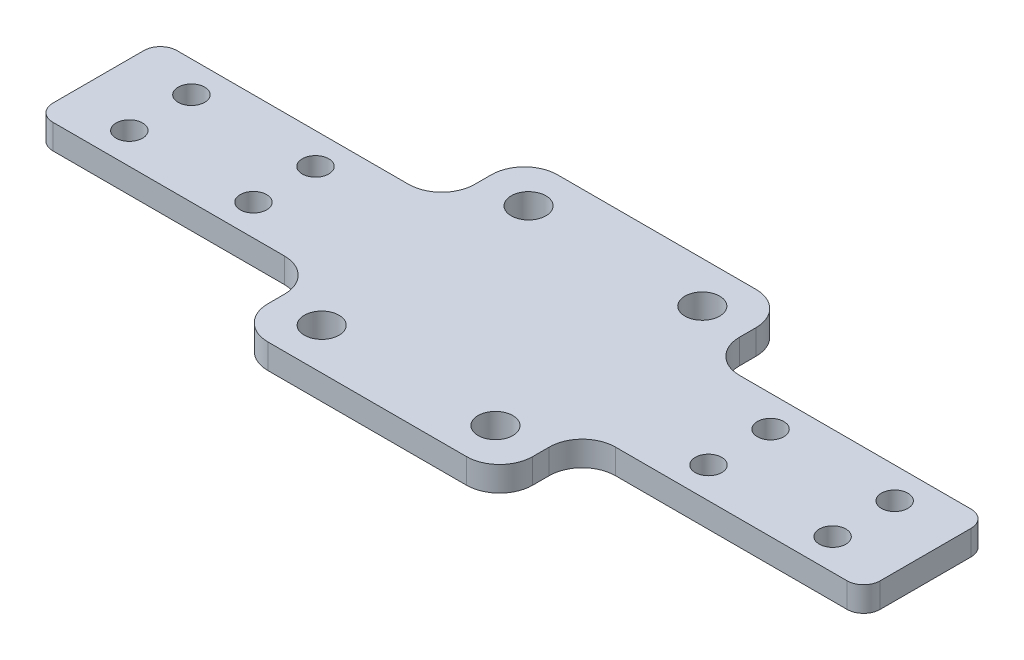
ISO-10303-21;
HEADER;
FILE_DESCRIPTION(('STEP AP214'),'2;1');
FILE_NAME('part.step','',(''),(''),'','','');
FILE_SCHEMA(('AUTOMOTIVE_DESIGN { 1 0 10303 214 1 1 1 1 }'));
ENDSEC;
DATA;
#1=APPLICATION_CONTEXT('core data for automotive mechanical design processes');
#2=APPLICATION_PROTOCOL_DEFINITION('international standard','automotive_design',2000,#1);
#3=PRODUCT_CONTEXT('',#1,'mechanical');
#4=PRODUCT('Part','Part','',(#3));
#5=PRODUCT_RELATED_PRODUCT_CATEGORY('part','',(#4));
#6=PRODUCT_DEFINITION_FORMATION('','',#4);
#7=PRODUCT_DEFINITION_CONTEXT('part definition',#1,'design');
#8=PRODUCT_DEFINITION('design','',#6,#7);
#9=PRODUCT_DEFINITION_SHAPE('','',#8);
#10=(LENGTH_UNIT() NAMED_UNIT(*) SI_UNIT(.MILLI.,.METRE.));
#11=(NAMED_UNIT(*) PLANE_ANGLE_UNIT() SI_UNIT($,.RADIAN.));
#12=(NAMED_UNIT(*) SI_UNIT($,.STERADIAN.) SOLID_ANGLE_UNIT());
#13=UNCERTAINTY_MEASURE_WITH_UNIT(LENGTH_MEASURE(1.E-05),#10,'distance_accuracy_value','');
#14=(GEOMETRIC_REPRESENTATION_CONTEXT(3) GLOBAL_UNCERTAINTY_ASSIGNED_CONTEXT((#13)) GLOBAL_UNIT_ASSIGNED_CONTEXT((#10,
#11,#12)) REPRESENTATION_CONTEXT('',''));
#15=CARTESIAN_POINT('',(0.,0.,0.));
#16=DIRECTION('',(0.,0.,1.));
#17=DIRECTION('',(1.,0.,0.));
#18=AXIS2_PLACEMENT_3D('',#15,#16,#17);
#19=CARTESIAN_POINT('',(-50.,3.,-7.5));
#20=DIRECTION('',(0.,0.,1.));
#21=DIRECTION('',(1.,0.,0.));
#22=AXIS2_PLACEMENT_3D('',#19,#20,#21);
#23=PLANE('',#22);
#24=DIRECTION('',(-1.,0.,0.));
#25=VECTOR('',#24,1.);
#26=CARTESIAN_POINT('',(-50.,0.,-7.5));
#27=LINE('',#26,#25);
#28=CARTESIAN_POINT('',(-20.,0.,-7.5));
#29=VERTEX_POINT('',#28);
#30=CARTESIAN_POINT('',(-48.,0.,-7.5));
#31=VERTEX_POINT('',#30);
#32=EDGE_CURVE('E299',#29,#31,#27,.T.);
#33=ORIENTED_EDGE('',*,*,#32,.T.);
#34=DIRECTION('',(0.,-1.,0.));
#35=VECTOR('',#34,1.);
#36=CARTESIAN_POINT('',(-48.,3.,-7.5));
#37=LINE('',#36,#35);
#38=CARTESIAN_POINT('',(-48.,3.,-7.5));
#39=VERTEX_POINT('',#38);
#40=EDGE_CURVE('E56',#31,#39,#37,.F.);
#41=ORIENTED_EDGE('',*,*,#40,.T.);
#42=DIRECTION('',(-1.,0.,0.));
#43=VECTOR('',#42,1.);
#44=CARTESIAN_POINT('',(-50.,3.,-7.5));
#45=LINE('',#44,#43);
#46=CARTESIAN_POINT('',(-20.,3.,-7.5));
#47=VERTEX_POINT('',#46);
#48=EDGE_CURVE('E419',#47,#39,#45,.T.);
#49=ORIENTED_EDGE('',*,*,#48,.F.);
#50=DIRECTION('',(0.,-1.,0.));
#51=VECTOR('',#50,1.);
#52=CARTESIAN_POINT('',(-20.,3.,-7.5));
#53=LINE('',#52,#51);
#54=EDGE_CURVE('E353',#47,#29,#53,.T.);
#55=ORIENTED_EDGE('',*,*,#54,.T.);
#56=EDGE_LOOP('',(#33,#41,#49,#55));
#57=FACE_BOUND('',#56,.T.);
#58=ADVANCED_FACE('F41',(#57),#23,.F.);
#59=CARTESIAN_POINT('',(-50.,3.,7.5));
#60=DIRECTION('',(0.,0.,-1.));
#61=DIRECTION('',(-1.,0.,0.));
#62=AXIS2_PLACEMENT_3D('',#59,#60,#61);
#63=PLANE('',#62);
#64=DIRECTION('',(1.,0.,0.));
#65=VECTOR('',#64,1.);
#66=CARTESIAN_POINT('',(-50.,3.,7.5));
#67=LINE('',#66,#65);
#68=CARTESIAN_POINT('',(-48.,3.,7.5));
#69=VERTEX_POINT('',#68);
#70=CARTESIAN_POINT('',(-20.,3.,7.5));
#71=VERTEX_POINT('',#70);
#72=EDGE_CURVE('E218',#69,#71,#67,.T.);
#73=ORIENTED_EDGE('',*,*,#72,.F.);
#74=DIRECTION('',(0.,-1.,0.));
#75=VECTOR('',#74,1.);
#76=CARTESIAN_POINT('',(-48.,3.,7.5));
#77=LINE('',#76,#75);
#78=CARTESIAN_POINT('',(-48.,0.,7.5));
#79=VERTEX_POINT('',#78);
#80=EDGE_CURVE('E235',#69,#79,#77,.T.);
#81=ORIENTED_EDGE('',*,*,#80,.T.);
#82=DIRECTION('',(1.,0.,0.));
#83=VECTOR('',#82,1.);
#84=CARTESIAN_POINT('',(-50.,0.,7.5));
#85=LINE('',#84,#83);
#86=CARTESIAN_POINT('',(-20.,0.,7.5));
#87=VERTEX_POINT('',#86);
#88=EDGE_CURVE('E312',#79,#87,#85,.T.);
#89=ORIENTED_EDGE('',*,*,#88,.T.);
#90=DIRECTION('',(0.,1.,0.));
#91=VECTOR('',#90,1.);
#92=CARTESIAN_POINT('',(-20.,3.,7.5));
#93=LINE('',#92,#91);
#94=EDGE_CURVE('E234',#87,#71,#93,.T.);
#95=ORIENTED_EDGE('',*,*,#94,.T.);
#96=EDGE_LOOP('',(#73,#81,#89,#95));
#97=FACE_BOUND('',#96,.T.);
#98=ADVANCED_FACE('F397',(#97),#63,.F.);
#99=CARTESIAN_POINT('',(50.,3.,7.5));
#100=DIRECTION('',(-1.,0.,0.));
#101=DIRECTION('',(0.,0.,1.));
#102=AXIS2_PLACEMENT_3D('',#99,#100,#101);
#103=PLANE('',#102);
#104=DIRECTION('',(0.,0.,-1.));
#105=VECTOR('',#104,1.);
#106=CARTESIAN_POINT('',(50.,3.,7.5));
#107=LINE('',#106,#105);
#108=CARTESIAN_POINT('',(50.,3.,5.5));
#109=VERTEX_POINT('',#108);
#110=CARTESIAN_POINT('',(50.,3.,-5.5));
#111=VERTEX_POINT('',#110);
#112=EDGE_CURVE('E297',#109,#111,#107,.T.);
#113=ORIENTED_EDGE('',*,*,#112,.F.);
#114=DIRECTION('',(0.,-1.,0.));
#115=VECTOR('',#114,1.);
#116=CARTESIAN_POINT('',(50.,3.,5.5));
#117=LINE('',#116,#115);
#118=CARTESIAN_POINT('',(50.,0.,5.5));
#119=VERTEX_POINT('',#118);
#120=EDGE_CURVE('E267',#109,#119,#117,.T.);
#121=ORIENTED_EDGE('',*,*,#120,.T.);
#122=DIRECTION('',(0.,0.,-1.));
#123=VECTOR('',#122,1.);
#124=CARTESIAN_POINT('',(50.,0.,7.5));
#125=LINE('',#124,#123);
#126=CARTESIAN_POINT('',(50.,0.,-5.5));
#127=VERTEX_POINT('',#126);
#128=EDGE_CURVE('E295',#119,#127,#125,.T.);
#129=ORIENTED_EDGE('',*,*,#128,.T.);
#130=DIRECTION('',(0.,-1.,0.));
#131=VECTOR('',#130,1.);
#132=CARTESIAN_POINT('',(50.,3.,-5.5));
#133=LINE('',#132,#131);
#134=EDGE_CURVE('E265',#127,#111,#133,.F.);
#135=ORIENTED_EDGE('',*,*,#134,.T.);
#136=EDGE_LOOP('',(#113,#121,#129,#135));
#137=FACE_BOUND('',#136,.T.);
#138=ADVANCED_FACE('F294',(#137),#103,.F.);
#139=CARTESIAN_POINT('',(48.,3.,-7.5));
#140=VERTEX_POINT('',#139);
#141=CARTESIAN_POINT('',(20.,3.,-7.5));
#142=VERTEX_POINT('',#141);
#143=EDGE_CURVE('E415',#140,#142,#45,.T.);
#144=ORIENTED_EDGE('',*,*,#143,.F.);
#145=DIRECTION('',(0.,-1.,0.));
#146=VECTOR('',#145,1.);
#147=CARTESIAN_POINT('',(48.,3.,-7.5));
#148=LINE('',#147,#146);
#149=CARTESIAN_POINT('',(48.,0.,-7.5));
#150=VERTEX_POINT('',#149);
#151=EDGE_CURVE('E11',#140,#150,#148,.T.);
#152=ORIENTED_EDGE('',*,*,#151,.T.);
#153=CARTESIAN_POINT('',(20.,0.,-7.5));
#154=VERTEX_POINT('',#153);
#155=EDGE_CURVE('E302',#150,#154,#27,.T.);
#156=ORIENTED_EDGE('',*,*,#155,.T.);
#157=DIRECTION('',(0.,1.,0.));
#158=VECTOR('',#157,1.);
#159=CARTESIAN_POINT('',(20.,3.,-7.5));
#160=LINE('',#159,#158);
#161=EDGE_CURVE('E356',#154,#142,#160,.T.);
#162=ORIENTED_EDGE('',*,*,#161,.T.);
#163=EDGE_LOOP('',(#144,#152,#156,#162));
#164=FACE_BOUND('',#163,.T.);
#165=ADVANCED_FACE('F399',(#164),#23,.F.);
#166=CARTESIAN_POINT('',(-50.,3.,7.5));
#167=DIRECTION('',(1.,0.,0.));
#168=DIRECTION('',(0.,0.,-1.));
#169=AXIS2_PLACEMENT_3D('',#166,#167,#168);
#170=PLANE('',#169);
#171=DIRECTION('',(0.,0.,1.));
#172=VECTOR('',#171,1.);
#173=CARTESIAN_POINT('',(-50.,0.,7.5));
#174=LINE('',#173,#172);
#175=CARTESIAN_POINT('',(-50.,0.,-5.5));
#176=VERTEX_POINT('',#175);
#177=CARTESIAN_POINT('',(-50.,0.,5.5));
#178=VERTEX_POINT('',#177);
#179=EDGE_CURVE('E309',#176,#178,#174,.T.);
#180=ORIENTED_EDGE('',*,*,#179,.T.);
#181=DIRECTION('',(0.,-1.,0.));
#182=VECTOR('',#181,1.);
#183=CARTESIAN_POINT('',(-50.,3.,5.5));
#184=LINE('',#183,#182);
#185=CARTESIAN_POINT('',(-50.,3.,5.5));
#186=VERTEX_POINT('',#185);
#187=EDGE_CURVE('E255',#178,#186,#184,.F.);
#188=ORIENTED_EDGE('',*,*,#187,.T.);
#189=DIRECTION('',(0.,0.,1.));
#190=VECTOR('',#189,1.);
#191=CARTESIAN_POINT('',(-50.,3.,7.5));
#192=LINE('',#191,#190);
#193=CARTESIAN_POINT('',(-50.,3.,-5.5));
#194=VERTEX_POINT('',#193);
#195=EDGE_CURVE('E287',#194,#186,#192,.T.);
#196=ORIENTED_EDGE('',*,*,#195,.F.);
#197=DIRECTION('',(0.,-1.,0.));
#198=VECTOR('',#197,1.);
#199=CARTESIAN_POINT('',(-50.,3.,-5.5));
#200=LINE('',#199,#198);
#201=EDGE_CURVE('E252',#194,#176,#200,.T.);
#202=ORIENTED_EDGE('',*,*,#201,.T.);
#203=EDGE_LOOP('',(#180,#188,#196,#202));
#204=FACE_BOUND('',#203,.T.);
#205=ADVANCED_FACE('F408',(#204),#170,.F.);
#206=CARTESIAN_POINT('',(20.,0.,7.5));
#207=VERTEX_POINT('',#206);
#208=CARTESIAN_POINT('',(48.,0.,7.5));
#209=VERTEX_POINT('',#208);
#210=EDGE_CURVE('E279',#207,#209,#85,.T.);
#211=ORIENTED_EDGE('',*,*,#210,.T.);
#212=DIRECTION('',(0.,-1.,0.));
#213=VECTOR('',#212,1.);
#214=CARTESIAN_POINT('',(48.,3.,7.5));
#215=LINE('',#214,#213);
#216=CARTESIAN_POINT('',(48.,3.,7.5));
#217=VERTEX_POINT('',#216);
#218=EDGE_CURVE('E49',#209,#217,#215,.F.);
#219=ORIENTED_EDGE('',*,*,#218,.T.);
#220=CARTESIAN_POINT('',(20.,3.,7.5));
#221=VERTEX_POINT('',#220);
#222=EDGE_CURVE('E276',#221,#217,#67,.T.);
#223=ORIENTED_EDGE('',*,*,#222,.F.);
#224=DIRECTION('',(0.,-1.,0.));
#225=VECTOR('',#224,1.);
#226=CARTESIAN_POINT('',(20.,3.,7.5));
#227=LINE('',#226,#225);
#228=EDGE_CURVE('E359',#221,#207,#227,.T.);
#229=ORIENTED_EDGE('',*,*,#228,.T.);
#230=EDGE_LOOP('',(#211,#219,#223,#229));
#231=FACE_BOUND('',#230,.T.);
#232=ADVANCED_FACE('F274',(#231),#63,.F.);
#233=CARTESIAN_POINT('',(0.,3.,0.));
#234=DIRECTION('',(0.,-1.,0.));
#235=DIRECTION('',(0.,0.,-1.));
#236=AXIS2_PLACEMENT_3D('',#233,#234,#235);
#237=PLANE('',#236);
#238=CARTESIAN_POINT('',(10.5,3.,-12.5));
#239=DIRECTION('',(0.,1.,0.));
#240=DIRECTION('',(0.,0.,-1.));
#241=AXIS2_PLACEMENT_3D('',#238,#239,#240);
#242=CIRCLE('',#241,2.1);
#243=CARTESIAN_POINT('',(10.5,3.,-14.6));
#244=VERTEX_POINT('',#243);
#245=EDGE_CURVE('E567',#244,#244,#242,.T.);
#246=ORIENTED_EDGE('',*,*,#245,.F.);
#247=EDGE_LOOP('',(#246));
#248=FACE_BOUND('',#247,.T.);
#249=CARTESIAN_POINT('',(10.5,3.,12.5));
#250=DIRECTION('',(0.,1.,0.));
#251=DIRECTION('',(0.,0.,1.));
#252=AXIS2_PLACEMENT_3D('',#249,#250,#251);
#253=CIRCLE('',#252,2.1);
#254=CARTESIAN_POINT('',(10.5,3.,14.6));
#255=VERTEX_POINT('',#254);
#256=EDGE_CURVE('E573',#255,#255,#253,.T.);
#257=ORIENTED_EDGE('',*,*,#256,.F.);
#258=EDGE_LOOP('',(#257));
#259=FACE_BOUND('',#258,.T.);
#260=CARTESIAN_POINT('',(-10.5,3.,12.5));
#261=DIRECTION('',(0.,1.,0.));
#262=DIRECTION('',(0.,0.,-1.));
#263=AXIS2_PLACEMENT_3D('',#260,#261,#262);
#264=CIRCLE('',#263,2.1);
#265=CARTESIAN_POINT('',(-10.5,3.,10.4));
#266=VERTEX_POINT('',#265);
#267=EDGE_CURVE('E561',#266,#266,#264,.T.);
#268=ORIENTED_EDGE('',*,*,#267,.F.);
#269=EDGE_LOOP('',(#268));
#270=FACE_BOUND('',#269,.T.);
#271=CARTESIAN_POINT('',(-10.5,3.,-12.5));
#272=DIRECTION('',(0.,1.,0.));
#273=DIRECTION('',(0.,0.,1.));
#274=AXIS2_PLACEMENT_3D('',#271,#272,#273);
#275=CIRCLE('',#274,2.1);
#276=CARTESIAN_POINT('',(-10.5,3.,-10.4));
#277=VERTEX_POINT('',#276);
#278=EDGE_CURVE('E558',#277,#277,#275,.T.);
#279=ORIENTED_EDGE('',*,*,#278,.F.);
#280=EDGE_LOOP('',(#279));
#281=FACE_BOUND('',#280,.T.);
#282=CARTESIAN_POINT('',(42.5,3.,3.75));
#283=DIRECTION('',(0.,1.,0.));
#284=DIRECTION('',(0.,0.,1.));
#285=AXIS2_PLACEMENT_3D('',#282,#283,#284);
#286=CIRCLE('',#285,1.6);
#287=CARTESIAN_POINT('',(42.5,3.,5.35));
#288=VERTEX_POINT('',#287);
#289=EDGE_CURVE('E531',#288,#288,#286,.T.);
#290=ORIENTED_EDGE('',*,*,#289,.F.);
#291=EDGE_LOOP('',(#290));
#292=FACE_BOUND('',#291,.T.);
#293=CARTESIAN_POINT('',(-27.5,3.,-3.75));
#294=DIRECTION('',(0.,1.,0.));
#295=DIRECTION('',(0.,0.,-1.));
#296=AXIS2_PLACEMENT_3D('',#293,#294,#295);
#297=CIRCLE('',#296,1.6);
#298=CARTESIAN_POINT('',(-27.5,3.,-5.35));
#299=VERTEX_POINT('',#298);
#300=EDGE_CURVE('E520',#299,#299,#297,.T.);
#301=ORIENTED_EDGE('',*,*,#300,.F.);
#302=EDGE_LOOP('',(#301));
#303=FACE_BOUND('',#302,.T.);
#304=CARTESIAN_POINT('',(-27.5,3.,3.75));
#305=DIRECTION('',(0.,1.,0.));
#306=DIRECTION('',(0.,0.,1.));
#307=AXIS2_PLACEMENT_3D('',#304,#305,#306);
#308=CIRCLE('',#307,1.6);
#309=CARTESIAN_POINT('',(-27.5,3.,5.35));
#310=VERTEX_POINT('',#309);
#311=EDGE_CURVE('E519',#310,#310,#308,.T.);
#312=ORIENTED_EDGE('',*,*,#311,.F.);
#313=EDGE_LOOP('',(#312));
#314=FACE_BOUND('',#313,.T.);
#315=CARTESIAN_POINT('',(-42.5,3.,3.75));
#316=DIRECTION('',(0.,1.,0.));
#317=DIRECTION('',(0.,0.,-1.));
#318=AXIS2_PLACEMENT_3D('',#315,#316,#317);
#319=CIRCLE('',#318,1.6);
#320=CARTESIAN_POINT('',(-42.5,3.,2.15));
#321=VERTEX_POINT('',#320);
#322=EDGE_CURVE('E514',#321,#321,#319,.T.);
#323=ORIENTED_EDGE('',*,*,#322,.F.);
#324=EDGE_LOOP('',(#323));
#325=FACE_BOUND('',#324,.T.);
#326=CARTESIAN_POINT('',(27.5,3.,-3.75));
#327=DIRECTION('',(0.,1.,0.));
#328=DIRECTION('',(0.,0.,1.));
#329=AXIS2_PLACEMENT_3D('',#326,#327,#328);
#330=CIRCLE('',#329,1.6);
#331=CARTESIAN_POINT('',(27.5,3.,-2.15));
#332=VERTEX_POINT('',#331);
#333=EDGE_CURVE('E544',#332,#332,#330,.T.);
#334=ORIENTED_EDGE('',*,*,#333,.F.);
#335=EDGE_LOOP('',(#334));
#336=FACE_BOUND('',#335,.T.);
#337=CARTESIAN_POINT('',(27.5,3.,3.75));
#338=DIRECTION('',(0.,1.,0.));
#339=DIRECTION('',(0.,0.,-1.));
#340=AXIS2_PLACEMENT_3D('',#337,#338,#339);
#341=CIRCLE('',#340,1.6);
#342=CARTESIAN_POINT('',(27.5,3.,2.15));
#343=VERTEX_POINT('',#342);
#344=EDGE_CURVE('E543',#343,#343,#341,.T.);
#345=ORIENTED_EDGE('',*,*,#344,.F.);
#346=EDGE_LOOP('',(#345));
#347=FACE_BOUND('',#346,.T.);
#348=CARTESIAN_POINT('',(42.5,3.,-3.75));
#349=DIRECTION('',(0.,1.,0.));
#350=DIRECTION('',(0.,0.,-1.));
#351=AXIS2_PLACEMENT_3D('',#348,#349,#350);
#352=CIRCLE('',#351,1.6);
#353=CARTESIAN_POINT('',(42.5,3.,-5.35));
#354=VERTEX_POINT('',#353);
#355=EDGE_CURVE('E532',#354,#354,#352,.T.);
#356=ORIENTED_EDGE('',*,*,#355,.F.);
#357=EDGE_LOOP('',(#356));
#358=FACE_BOUND('',#357,.T.);
#359=CARTESIAN_POINT('',(-42.5,3.,-3.75));
#360=DIRECTION('',(0.,1.,0.));
#361=DIRECTION('',(0.,0.,1.));
#362=AXIS2_PLACEMENT_3D('',#359,#360,#361);
#363=CIRCLE('',#362,1.6);
#364=CARTESIAN_POINT('',(-42.5,3.,-2.15));
#365=VERTEX_POINT('',#364);
#366=EDGE_CURVE('E453',#365,#365,#363,.T.);
#367=ORIENTED_EDGE('',*,*,#366,.F.);
#368=EDGE_LOOP('',(#367));
#369=FACE_BOUND('',#368,.T.);
#370=ORIENTED_EDGE('',*,*,#195,.T.);
#371=CARTESIAN_POINT('',(-48.,3.,5.5));
#372=DIRECTION('',(0.,-1.,0.));
#373=DIRECTION('',(0.,0.,-1.));
#374=AXIS2_PLACEMENT_3D('',#371,#372,#373);
#375=CIRCLE('',#374,2.);
#376=EDGE_CURVE('E262',#186,#69,#375,.F.);
#377=ORIENTED_EDGE('',*,*,#376,.T.);
#378=ORIENTED_EDGE('',*,*,#72,.T.);
#379=CARTESIAN_POINT('',(-20.,3.,11.5));
#380=DIRECTION('',(0.,-1.,0.));
#381=DIRECTION('',(0.,0.,-1.));
#382=AXIS2_PLACEMENT_3D('',#379,#380,#381);
#383=CIRCLE('',#382,4.);
#384=CARTESIAN_POINT('',(-16.,3.,11.5));
#385=VERTEX_POINT('',#384);
#386=EDGE_CURVE('E236',#71,#385,#383,.T.);
#387=ORIENTED_EDGE('',*,*,#386,.T.);
#388=DIRECTION('',(0.,0.,1.));
#389=VECTOR('',#388,1.);
#390=CARTESIAN_POINT('',(-16.,3.,-17.5));
#391=LINE('',#390,#389);
#392=CARTESIAN_POINT('',(-16.,3.,13.5));
#393=VERTEX_POINT('',#392);
#394=EDGE_CURVE('E213',#385,#393,#391,.T.);
#395=ORIENTED_EDGE('',*,*,#394,.T.);
#396=CARTESIAN_POINT('',(-12.,3.,13.5));
#397=DIRECTION('',(0.,-1.,0.));
#398=DIRECTION('',(0.,0.,-1.));
#399=AXIS2_PLACEMENT_3D('',#396,#397,#398);
#400=CIRCLE('',#399,4.);
#401=CARTESIAN_POINT('',(-12.,3.,17.5));
#402=VERTEX_POINT('',#401);
#403=EDGE_CURVE('E321',#393,#402,#400,.F.);
#404=ORIENTED_EDGE('',*,*,#403,.T.);
#405=DIRECTION('',(1.,0.,0.));
#406=VECTOR('',#405,1.);
#407=CARTESIAN_POINT('',(-16.,3.,17.5));
#408=LINE('',#407,#406);
#409=CARTESIAN_POINT('',(12.,3.,17.5));
#410=VERTEX_POINT('',#409);
#411=EDGE_CURVE('E459',#402,#410,#408,.T.);
#412=ORIENTED_EDGE('',*,*,#411,.T.);
#413=CARTESIAN_POINT('',(12.,3.,13.5));
#414=DIRECTION('',(0.,-1.,0.));
#415=DIRECTION('',(0.,0.,-1.));
#416=AXIS2_PLACEMENT_3D('',#413,#414,#415);
#417=CIRCLE('',#416,4.);
#418=CARTESIAN_POINT('',(16.,3.,13.5));
#419=VERTEX_POINT('',#418);
#420=EDGE_CURVE('E319',#410,#419,#417,.F.);
#421=ORIENTED_EDGE('',*,*,#420,.T.);
#422=DIRECTION('',(0.,0.,-1.));
#423=VECTOR('',#422,1.);
#424=CARTESIAN_POINT('',(16.,3.,-17.5));
#425=LINE('',#424,#423);
#426=CARTESIAN_POINT('',(16.,3.,11.5));
#427=VERTEX_POINT('',#426);
#428=EDGE_CURVE('E462',#419,#427,#425,.T.);
#429=ORIENTED_EDGE('',*,*,#428,.T.);
#430=CARTESIAN_POINT('',(20.,3.,11.5));
#431=DIRECTION('',(0.,-1.,0.));
#432=DIRECTION('',(0.,0.,-1.));
#433=AXIS2_PLACEMENT_3D('',#430,#431,#432);
#434=CIRCLE('',#433,4.);
#435=EDGE_CURVE('E241',#427,#221,#434,.T.);
#436=ORIENTED_EDGE('',*,*,#435,.T.);
#437=ORIENTED_EDGE('',*,*,#222,.T.);
#438=CARTESIAN_POINT('',(48.,3.,5.5));
#439=DIRECTION('',(0.,-1.,0.));
#440=DIRECTION('',(0.,0.,-1.));
#441=AXIS2_PLACEMENT_3D('',#438,#439,#440);
#442=CIRCLE('',#441,2.);
#443=EDGE_CURVE('E258',#217,#109,#442,.F.);
#444=ORIENTED_EDGE('',*,*,#443,.T.);
#445=ORIENTED_EDGE('',*,*,#112,.T.);
#446=CARTESIAN_POINT('',(48.,3.,-5.5));
#447=DIRECTION('',(0.,-1.,0.));
#448=DIRECTION('',(0.,0.,-1.));
#449=AXIS2_PLACEMENT_3D('',#446,#447,#448);
#450=CIRCLE('',#449,2.);
#451=EDGE_CURVE('E64',#111,#140,#450,.F.);
#452=ORIENTED_EDGE('',*,*,#451,.T.);
#453=ORIENTED_EDGE('',*,*,#143,.T.);
#454=CARTESIAN_POINT('',(20.,3.,-11.5));
#455=DIRECTION('',(0.,-1.,0.));
#456=DIRECTION('',(0.,0.,-1.));
#457=AXIS2_PLACEMENT_3D('',#454,#455,#456);
#458=CIRCLE('',#457,4.);
#459=CARTESIAN_POINT('',(16.,3.,-11.5));
#460=VERTEX_POINT('',#459);
#461=EDGE_CURVE('E366',#142,#460,#458,.T.);
#462=ORIENTED_EDGE('',*,*,#461,.T.);
#463=CARTESIAN_POINT('',(16.,3.,-13.5));
#464=VERTEX_POINT('',#463);
#465=EDGE_CURVE('E461',#460,#464,#425,.T.);
#466=ORIENTED_EDGE('',*,*,#465,.T.);
#467=CARTESIAN_POINT('',(12.,3.,-13.5));
#468=DIRECTION('',(0.,-1.,0.));
#469=DIRECTION('',(0.,0.,-1.));
#470=AXIS2_PLACEMENT_3D('',#467,#468,#469);
#471=CIRCLE('',#470,4.);
#472=CARTESIAN_POINT('',(12.,3.,-17.5));
#473=VERTEX_POINT('',#472);
#474=EDGE_CURVE('E317',#464,#473,#471,.F.);
#475=ORIENTED_EDGE('',*,*,#474,.T.);
#476=DIRECTION('',(-1.,0.,0.));
#477=VECTOR('',#476,1.);
#478=CARTESIAN_POINT('',(-16.,3.,-17.5));
#479=LINE('',#478,#477);
#480=CARTESIAN_POINT('',(-12.,3.,-17.5));
#481=VERTEX_POINT('',#480);
#482=EDGE_CURVE('E230',#473,#481,#479,.T.);
#483=ORIENTED_EDGE('',*,*,#482,.T.);
#484=CARTESIAN_POINT('',(-12.,3.,-13.5));
#485=DIRECTION('',(0.,-1.,0.));
#486=DIRECTION('',(0.,0.,-1.));
#487=AXIS2_PLACEMENT_3D('',#484,#485,#486);
#488=CIRCLE('',#487,4.);
#489=CARTESIAN_POINT('',(-16.,3.,-13.5));
#490=VERTEX_POINT('',#489);
#491=EDGE_CURVE('E315',#481,#490,#488,.F.);
#492=ORIENTED_EDGE('',*,*,#491,.T.);
#493=CARTESIAN_POINT('',(-16.,3.,-11.5));
#494=VERTEX_POINT('',#493);
#495=EDGE_CURVE('E457',#490,#494,#391,.T.);
#496=ORIENTED_EDGE('',*,*,#495,.T.);
#497=CARTESIAN_POINT('',(-20.,3.,-11.5));
#498=DIRECTION('',(0.,-1.,0.));
#499=DIRECTION('',(0.,0.,-1.));
#500=AXIS2_PLACEMENT_3D('',#497,#498,#499);
#501=CIRCLE('',#500,4.);
#502=EDGE_CURVE('E364',#494,#47,#501,.T.);
#503=ORIENTED_EDGE('',*,*,#502,.T.);
#504=ORIENTED_EDGE('',*,*,#48,.T.);
#505=CARTESIAN_POINT('',(-48.,3.,-5.5));
#506=DIRECTION('',(0.,-1.,0.));
#507=DIRECTION('',(0.,0.,-1.));
#508=AXIS2_PLACEMENT_3D('',#505,#506,#507);
#509=CIRCLE('',#508,2.);
#510=EDGE_CURVE('E260',#39,#194,#509,.F.);
#511=ORIENTED_EDGE('',*,*,#510,.T.);
#512=EDGE_LOOP('',(#370,#377,#378,#387,#395,#404,#412,#421,#429,#436,#437,#444,#445,#452,#453,
#462,#466,#475,#483,#492,#496,#503,#504,#511));
#513=FACE_BOUND('',#512,.T.);
#514=ADVANCED_FACE('F283',(#248,#259,#270,#281,#292,#303,#314,#325,#336,#347,#358,#369,#513),
#237,.F.);
#515=CARTESIAN_POINT('',(0.,0.,0.));
#516=DIRECTION('',(0.,-1.,0.));
#517=DIRECTION('',(0.,0.,-1.));
#518=AXIS2_PLACEMENT_3D('',#515,#516,#517);
#519=PLANE('',#518);
#520=CARTESIAN_POINT('',(10.5,0.,-12.5));
#521=DIRECTION('',(0.,1.,0.));
#522=DIRECTION('',(0.,0.,-1.));
#523=AXIS2_PLACEMENT_3D('',#520,#521,#522);
#524=CIRCLE('',#523,2.1);
#525=CARTESIAN_POINT('',(10.5,0.,-14.6));
#526=VERTEX_POINT('',#525);
#527=EDGE_CURVE('E564',#526,#526,#524,.T.);
#528=ORIENTED_EDGE('',*,*,#527,.T.);
#529=EDGE_LOOP('',(#528));
#530=FACE_BOUND('',#529,.T.);
#531=CARTESIAN_POINT('',(10.5,0.,12.5));
#532=DIRECTION('',(0.,1.,0.));
#533=DIRECTION('',(0.,0.,1.));
#534=AXIS2_PLACEMENT_3D('',#531,#532,#533);
#535=CIRCLE('',#534,2.1);
#536=CARTESIAN_POINT('',(10.5,0.,14.6));
#537=VERTEX_POINT('',#536);
#538=EDGE_CURVE('E570',#537,#537,#535,.T.);
#539=ORIENTED_EDGE('',*,*,#538,.T.);
#540=EDGE_LOOP('',(#539));
#541=FACE_BOUND('',#540,.T.);
#542=CARTESIAN_POINT('',(-10.5,0.,12.5));
#543=DIRECTION('',(0.,1.,0.));
#544=DIRECTION('',(0.,0.,-1.));
#545=AXIS2_PLACEMENT_3D('',#542,#543,#544);
#546=CIRCLE('',#545,2.1);
#547=CARTESIAN_POINT('',(-10.5,0.,10.4));
#548=VERTEX_POINT('',#547);
#549=EDGE_CURVE('E576',#548,#548,#546,.T.);
#550=ORIENTED_EDGE('',*,*,#549,.T.);
#551=EDGE_LOOP('',(#550));
#552=FACE_BOUND('',#551,.T.);
#553=CARTESIAN_POINT('',(-10.5,0.,-12.5));
#554=DIRECTION('',(0.,1.,0.));
#555=DIRECTION('',(0.,0.,1.));
#556=AXIS2_PLACEMENT_3D('',#553,#554,#555);
#557=CIRCLE('',#556,2.1);
#558=CARTESIAN_POINT('',(-10.5,0.,-10.4));
#559=VERTEX_POINT('',#558);
#560=EDGE_CURVE('E555',#559,#559,#557,.T.);
#561=ORIENTED_EDGE('',*,*,#560,.T.);
#562=EDGE_LOOP('',(#561));
#563=FACE_BOUND('',#562,.T.);
#564=CARTESIAN_POINT('',(42.5,0.,3.75));
#565=DIRECTION('',(0.,1.,0.));
#566=DIRECTION('',(0.,0.,1.));
#567=AXIS2_PLACEMENT_3D('',#564,#565,#566);
#568=CIRCLE('',#567,1.6);
#569=CARTESIAN_POINT('',(42.5,0.,5.35));
#570=VERTEX_POINT('',#569);
#571=EDGE_CURVE('E528',#570,#570,#568,.T.);
#572=ORIENTED_EDGE('',*,*,#571,.T.);
#573=EDGE_LOOP('',(#572));
#574=FACE_BOUND('',#573,.T.);
#575=CARTESIAN_POINT('',(-27.5,0.,-3.75));
#576=DIRECTION('',(0.,1.,0.));
#577=DIRECTION('',(0.,0.,-1.));
#578=AXIS2_PLACEMENT_3D('',#575,#576,#577);
#579=CIRCLE('',#578,1.6);
#580=CARTESIAN_POINT('',(-27.5,0.,-5.35));
#581=VERTEX_POINT('',#580);
#582=EDGE_CURVE('E535',#581,#581,#579,.T.);
#583=ORIENTED_EDGE('',*,*,#582,.T.);
#584=EDGE_LOOP('',(#583));
#585=FACE_BOUND('',#584,.T.);
#586=CARTESIAN_POINT('',(-27.5,0.,3.75));
#587=DIRECTION('',(0.,1.,0.));
#588=DIRECTION('',(0.,0.,1.));
#589=AXIS2_PLACEMENT_3D('',#586,#587,#588);
#590=CIRCLE('',#589,1.6);
#591=CARTESIAN_POINT('',(-27.5,0.,5.35));
#592=VERTEX_POINT('',#591);
#593=EDGE_CURVE('E516',#592,#592,#590,.T.);
#594=ORIENTED_EDGE('',*,*,#593,.T.);
#595=EDGE_LOOP('',(#594));
#596=FACE_BOUND('',#595,.T.);
#597=CARTESIAN_POINT('',(-42.5,0.,3.75));
#598=DIRECTION('',(0.,1.,0.));
#599=DIRECTION('',(0.,0.,-1.));
#600=AXIS2_PLACEMENT_3D('',#597,#598,#599);
#601=CIRCLE('',#600,1.6);
#602=CARTESIAN_POINT('',(-42.5,0.,2.15));
#603=VERTEX_POINT('',#602);
#604=EDGE_CURVE('E523',#603,#603,#601,.T.);
#605=ORIENTED_EDGE('',*,*,#604,.T.);
#606=EDGE_LOOP('',(#605));
#607=FACE_BOUND('',#606,.T.);
#608=CARTESIAN_POINT('',(27.5,0.,-3.75));
#609=DIRECTION('',(0.,1.,0.));
#610=DIRECTION('',(0.,0.,1.));
#611=AXIS2_PLACEMENT_3D('',#608,#609,#610);
#612=CIRCLE('',#611,1.6);
#613=CARTESIAN_POINT('',(27.5,0.,-2.15));
#614=VERTEX_POINT('',#613);
#615=EDGE_CURVE('E552',#614,#614,#612,.T.);
#616=ORIENTED_EDGE('',*,*,#615,.T.);
#617=EDGE_LOOP('',(#616));
#618=FACE_BOUND('',#617,.T.);
#619=CARTESIAN_POINT('',(27.5,0.,3.75));
#620=DIRECTION('',(0.,1.,0.));
#621=DIRECTION('',(0.,0.,-1.));
#622=AXIS2_PLACEMENT_3D('',#619,#620,#621);
#623=CIRCLE('',#622,1.6);
#624=CARTESIAN_POINT('',(27.5,0.,2.15));
#625=VERTEX_POINT('',#624);
#626=EDGE_CURVE('E540',#625,#625,#623,.T.);
#627=ORIENTED_EDGE('',*,*,#626,.T.);
#628=EDGE_LOOP('',(#627));
#629=FACE_BOUND('',#628,.T.);
#630=CARTESIAN_POINT('',(42.5,0.,-3.75));
#631=DIRECTION('',(0.,1.,0.));
#632=DIRECTION('',(0.,0.,-1.));
#633=AXIS2_PLACEMENT_3D('',#630,#631,#632);
#634=CIRCLE('',#633,1.6);
#635=CARTESIAN_POINT('',(42.5,0.,-5.35));
#636=VERTEX_POINT('',#635);
#637=EDGE_CURVE('E547',#636,#636,#634,.T.);
#638=ORIENTED_EDGE('',*,*,#637,.T.);
#639=EDGE_LOOP('',(#638));
#640=FACE_BOUND('',#639,.T.);
#641=CARTESIAN_POINT('',(-42.5,0.,-3.75));
#642=DIRECTION('',(0.,1.,0.));
#643=DIRECTION('',(0.,0.,1.));
#644=AXIS2_PLACEMENT_3D('',#641,#642,#643);
#645=CIRCLE('',#644,1.6);
#646=CARTESIAN_POINT('',(-42.5,0.,-2.15));
#647=VERTEX_POINT('',#646);
#648=EDGE_CURVE('E509',#647,#647,#645,.T.);
#649=ORIENTED_EDGE('',*,*,#648,.T.);
#650=EDGE_LOOP('',(#649));
#651=FACE_BOUND('',#650,.T.);
#652=ORIENTED_EDGE('',*,*,#88,.F.);
#653=CARTESIAN_POINT('',(-48.,0.,5.5));
#654=DIRECTION('',(0.,-1.,0.));
#655=DIRECTION('',(0.,0.,-1.));
#656=AXIS2_PLACEMENT_3D('',#653,#654,#655);
#657=CIRCLE('',#656,2.);
#658=EDGE_CURVE('E250',#79,#178,#657,.T.);
#659=ORIENTED_EDGE('',*,*,#658,.T.);
#660=ORIENTED_EDGE('',*,*,#179,.F.);
#661=CARTESIAN_POINT('',(-48.,0.,-5.5));
#662=DIRECTION('',(0.,-1.,0.));
#663=DIRECTION('',(0.,0.,-1.));
#664=AXIS2_PLACEMENT_3D('',#661,#662,#663);
#665=CIRCLE('',#664,2.);
#666=EDGE_CURVE('E248',#176,#31,#665,.T.);
#667=ORIENTED_EDGE('',*,*,#666,.T.);
#668=ORIENTED_EDGE('',*,*,#32,.F.);
#669=CARTESIAN_POINT('',(-20.,0.,-11.5));
#670=DIRECTION('',(0.,-1.,0.));
#671=DIRECTION('',(0.,0.,-1.));
#672=AXIS2_PLACEMENT_3D('',#669,#670,#671);
#673=CIRCLE('',#672,4.);
#674=CARTESIAN_POINT('',(-16.,0.,-11.5));
#675=VERTEX_POINT('',#674);
#676=EDGE_CURVE('E362',#29,#675,#673,.F.);
#677=ORIENTED_EDGE('',*,*,#676,.T.);
#678=DIRECTION('',(0.,0.,1.));
#679=VECTOR('',#678,1.);
#680=CARTESIAN_POINT('',(-16.,0.,-17.5));
#681=LINE('',#680,#679);
#682=CARTESIAN_POINT('',(-16.,0.,-13.5));
#683=VERTEX_POINT('',#682);
#684=EDGE_CURVE('E229',#683,#675,#681,.T.);
#685=ORIENTED_EDGE('',*,*,#684,.F.);
#686=CARTESIAN_POINT('',(-12.,0.,-13.5));
#687=DIRECTION('',(0.,-1.,0.));
#688=DIRECTION('',(0.,0.,-1.));
#689=AXIS2_PLACEMENT_3D('',#686,#687,#688);
#690=CIRCLE('',#689,4.);
#691=CARTESIAN_POINT('',(-12.,0.,-17.5));
#692=VERTEX_POINT('',#691);
#693=EDGE_CURVE('E328',#683,#692,#690,.T.);
#694=ORIENTED_EDGE('',*,*,#693,.T.);
#695=DIRECTION('',(-1.,0.,0.));
#696=VECTOR('',#695,1.);
#697=CARTESIAN_POINT('',(-16.,0.,-17.5));
#698=LINE('',#697,#696);
#699=CARTESIAN_POINT('',(12.,0.,-17.5));
#700=VERTEX_POINT('',#699);
#701=EDGE_CURVE('E300',#700,#692,#698,.T.);
#702=ORIENTED_EDGE('',*,*,#701,.F.);
#703=CARTESIAN_POINT('',(12.,0.,-13.5));
#704=DIRECTION('',(0.,-1.,0.));
#705=DIRECTION('',(0.,0.,-1.));
#706=AXIS2_PLACEMENT_3D('',#703,#704,#705);
#707=CIRCLE('',#706,4.);
#708=CARTESIAN_POINT('',(16.,0.,-13.5));
#709=VERTEX_POINT('',#708);
#710=EDGE_CURVE('E330',#700,#709,#707,.T.);
#711=ORIENTED_EDGE('',*,*,#710,.T.);
#712=DIRECTION('',(0.,0.,-1.));
#713=VECTOR('',#712,1.);
#714=CARTESIAN_POINT('',(16.,0.,-17.5));
#715=LINE('',#714,#713);
#716=CARTESIAN_POINT('',(16.,0.,-11.5));
#717=VERTEX_POINT('',#716);
#718=EDGE_CURVE('E381',#717,#709,#715,.T.);
#719=ORIENTED_EDGE('',*,*,#718,.F.);
#720=CARTESIAN_POINT('',(20.,0.,-11.5));
#721=DIRECTION('',(0.,-1.,0.));
#722=DIRECTION('',(0.,0.,-1.));
#723=AXIS2_PLACEMENT_3D('',#720,#721,#722);
#724=CIRCLE('',#723,4.);
#725=EDGE_CURVE('E368',#717,#154,#724,.F.);
#726=ORIENTED_EDGE('',*,*,#725,.T.);
#727=ORIENTED_EDGE('',*,*,#155,.F.);
#728=CARTESIAN_POINT('',(48.,0.,-5.5));
#729=DIRECTION('',(0.,-1.,0.));
#730=DIRECTION('',(0.,0.,-1.));
#731=AXIS2_PLACEMENT_3D('',#728,#729,#730);
#732=CIRCLE('',#731,2.);
#733=EDGE_CURVE('E239',#150,#127,#732,.T.);
#734=ORIENTED_EDGE('',*,*,#733,.T.);
#735=ORIENTED_EDGE('',*,*,#128,.F.);
#736=CARTESIAN_POINT('',(48.,0.,5.5));
#737=DIRECTION('',(0.,-1.,0.));
#738=DIRECTION('',(0.,0.,-1.));
#739=AXIS2_PLACEMENT_3D('',#736,#737,#738);
#740=CIRCLE('',#739,2.);
#741=EDGE_CURVE('E246',#119,#209,#740,.T.);
#742=ORIENTED_EDGE('',*,*,#741,.T.);
#743=ORIENTED_EDGE('',*,*,#210,.F.);
#744=CARTESIAN_POINT('',(20.,0.,11.5));
#745=DIRECTION('',(0.,-1.,0.));
#746=DIRECTION('',(0.,0.,-1.));
#747=AXIS2_PLACEMENT_3D('',#744,#745,#746);
#748=CIRCLE('',#747,4.);
#749=CARTESIAN_POINT('',(16.,0.,11.5));
#750=VERTEX_POINT('',#749);
#751=EDGE_CURVE('E371',#207,#750,#748,.F.);
#752=ORIENTED_EDGE('',*,*,#751,.T.);
#753=CARTESIAN_POINT('',(16.,0.,13.5));
#754=VERTEX_POINT('',#753);
#755=EDGE_CURVE('E305',#754,#750,#715,.T.);
#756=ORIENTED_EDGE('',*,*,#755,.F.);
#757=CARTESIAN_POINT('',(12.,0.,13.5));
#758=DIRECTION('',(0.,-1.,0.));
#759=DIRECTION('',(0.,0.,-1.));
#760=AXIS2_PLACEMENT_3D('',#757,#758,#759);
#761=CIRCLE('',#760,4.);
#762=CARTESIAN_POINT('',(12.,0.,17.5));
#763=VERTEX_POINT('',#762);
#764=EDGE_CURVE('E332',#754,#763,#761,.T.);
#765=ORIENTED_EDGE('',*,*,#764,.T.);
#766=DIRECTION('',(1.,0.,0.));
#767=VECTOR('',#766,1.);
#768=CARTESIAN_POINT('',(-16.,0.,17.5));
#769=LINE('',#768,#767);
#770=CARTESIAN_POINT('',(-12.,0.,17.5));
#771=VERTEX_POINT('',#770);
#772=EDGE_CURVE('E449',#771,#763,#769,.T.);
#773=ORIENTED_EDGE('',*,*,#772,.F.);
#774=CARTESIAN_POINT('',(-12.,0.,13.5));
#775=DIRECTION('',(0.,-1.,0.));
#776=DIRECTION('',(0.,0.,-1.));
#777=AXIS2_PLACEMENT_3D('',#774,#775,#776);
#778=CIRCLE('',#777,4.);
#779=CARTESIAN_POINT('',(-16.,0.,13.5));
#780=VERTEX_POINT('',#779);
#781=EDGE_CURVE('E228',#771,#780,#778,.T.);
#782=ORIENTED_EDGE('',*,*,#781,.T.);
#783=CARTESIAN_POINT('',(-16.,0.,11.5));
#784=VERTEX_POINT('',#783);
#785=EDGE_CURVE('E210',#784,#780,#681,.T.);
#786=ORIENTED_EDGE('',*,*,#785,.F.);
#787=CARTESIAN_POINT('',(-20.,0.,11.5));
#788=DIRECTION('',(0.,-1.,0.));
#789=DIRECTION('',(0.,0.,-1.));
#790=AXIS2_PLACEMENT_3D('',#787,#788,#789);
#791=CIRCLE('',#790,4.);
#792=EDGE_CURVE('E224',#784,#87,#791,.F.);
#793=ORIENTED_EDGE('',*,*,#792,.T.);
#794=EDGE_LOOP('',(#652,#659,#660,#667,#668,#677,#685,#694,#702,#711,#719,#726,#727,#734,#735,
#742,#743,#752,#756,#765,#773,#782,#786,#793));
#795=FACE_BOUND('',#794,.T.);
#796=ADVANCED_FACE('F223',(#530,#541,#552,#563,#574,#585,#596,#607,#618,#629,#640,#651,#795),
#519,.T.);
#797=CARTESIAN_POINT('',(-16.,0.,17.5));
#798=DIRECTION('',(0.,0.,1.));
#799=DIRECTION('',(1.,0.,0.));
#800=AXIS2_PLACEMENT_3D('',#797,#798,#799);
#801=PLANE('',#800);
#802=ORIENTED_EDGE('',*,*,#411,.F.);
#803=DIRECTION('',(0.,1.,0.));
#804=VECTOR('',#803,1.);
#805=CARTESIAN_POINT('',(-12.,0.,17.5));
#806=LINE('',#805,#804);
#807=EDGE_CURVE('E326',#402,#771,#806,.F.);
#808=ORIENTED_EDGE('',*,*,#807,.T.);
#809=ORIENTED_EDGE('',*,*,#772,.T.);
#810=DIRECTION('',(0.,1.,0.));
#811=VECTOR('',#810,1.);
#812=CARTESIAN_POINT('',(12.,0.,17.5));
#813=LINE('',#812,#811);
#814=EDGE_CURVE('E323',#763,#410,#813,.T.);
#815=ORIENTED_EDGE('',*,*,#814,.T.);
#816=EDGE_LOOP('',(#802,#808,#809,#815));
#817=FACE_BOUND('',#816,.T.);
#818=ADVANCED_FACE('F624',(#817),#801,.T.);
#819=CARTESIAN_POINT('',(16.,0.,-17.5));
#820=DIRECTION('',(1.,0.,0.));
#821=DIRECTION('',(0.,0.,-1.));
#822=AXIS2_PLACEMENT_3D('',#819,#820,#821);
#823=PLANE('',#822);
#824=ORIENTED_EDGE('',*,*,#428,.F.);
#825=DIRECTION('',(0.,1.,0.));
#826=VECTOR('',#825,1.);
#827=CARTESIAN_POINT('',(16.,0.,13.5));
#828=LINE('',#827,#826);
#829=EDGE_CURVE('E337',#419,#754,#828,.F.);
#830=ORIENTED_EDGE('',*,*,#829,.T.);
#831=ORIENTED_EDGE('',*,*,#755,.T.);
#832=DIRECTION('',(0.,-1.,0.));
#833=VECTOR('',#832,1.);
#834=CARTESIAN_POINT('',(16.,0.,11.5));
#835=LINE('',#834,#833);
#836=EDGE_CURVE('E335',#750,#427,#835,.F.);
#837=ORIENTED_EDGE('',*,*,#836,.T.);
#838=EDGE_LOOP('',(#824,#830,#831,#837));
#839=FACE_BOUND('',#838,.T.);
#840=ADVANCED_FACE('F379',(#839),#823,.T.);
#841=CARTESIAN_POINT('',(-16.,0.,-17.5));
#842=DIRECTION('',(-1.,0.,0.));
#843=DIRECTION('',(0.,0.,1.));
#844=AXIS2_PLACEMENT_3D('',#841,#842,#843);
#845=PLANE('',#844);
#846=ORIENTED_EDGE('',*,*,#785,.T.);
#847=DIRECTION('',(0.,1.,0.));
#848=VECTOR('',#847,1.);
#849=CARTESIAN_POINT('',(-16.,0.,13.5));
#850=LINE('',#849,#848);
#851=EDGE_CURVE('E217',#780,#393,#850,.T.);
#852=ORIENTED_EDGE('',*,*,#851,.T.);
#853=ORIENTED_EDGE('',*,*,#394,.F.);
#854=DIRECTION('',(0.,1.,0.));
#855=VECTOR('',#854,1.);
#856=CARTESIAN_POINT('',(-16.,0.,11.5));
#857=LINE('',#856,#855);
#858=EDGE_CURVE('E206',#385,#784,#857,.F.);
#859=ORIENTED_EDGE('',*,*,#858,.T.);
#860=EDGE_LOOP('',(#846,#852,#853,#859));
#861=FACE_BOUND('',#860,.T.);
#862=ADVANCED_FACE('F208',(#861),#845,.T.);
#863=ORIENTED_EDGE('',*,*,#495,.F.);
#864=DIRECTION('',(0.,1.,0.));
#865=VECTOR('',#864,1.);
#866=CARTESIAN_POINT('',(-16.,0.,-13.5));
#867=LINE('',#866,#865);
#868=EDGE_CURVE('E351',#490,#683,#867,.F.);
#869=ORIENTED_EDGE('',*,*,#868,.T.);
#870=ORIENTED_EDGE('',*,*,#684,.T.);
#871=DIRECTION('',(0.,-1.,0.));
#872=VECTOR('',#871,1.);
#873=CARTESIAN_POINT('',(-16.,0.,-11.5));
#874=LINE('',#873,#872);
#875=EDGE_CURVE('E349',#675,#494,#874,.F.);
#876=ORIENTED_EDGE('',*,*,#875,.T.);
#877=EDGE_LOOP('',(#863,#869,#870,#876));
#878=FACE_BOUND('',#877,.T.);
#879=ADVANCED_FACE('F446',(#878),#845,.T.);
#880=ORIENTED_EDGE('',*,*,#718,.T.);
#881=DIRECTION('',(0.,1.,0.));
#882=VECTOR('',#881,1.);
#883=CARTESIAN_POINT('',(16.,0.,-13.5));
#884=LINE('',#883,#882);
#885=EDGE_CURVE('E341',#709,#464,#884,.T.);
#886=ORIENTED_EDGE('',*,*,#885,.T.);
#887=ORIENTED_EDGE('',*,*,#465,.F.);
#888=DIRECTION('',(0.,1.,0.));
#889=VECTOR('',#888,1.);
#890=CARTESIAN_POINT('',(16.,0.,-11.5));
#891=LINE('',#890,#889);
#892=EDGE_CURVE('E339',#460,#717,#891,.F.);
#893=ORIENTED_EDGE('',*,*,#892,.T.);
#894=EDGE_LOOP('',(#880,#886,#887,#893));
#895=FACE_BOUND('',#894,.T.);
#896=ADVANCED_FACE('F469',(#895),#823,.T.);
#897=CARTESIAN_POINT('',(-16.,0.,-17.5));
#898=DIRECTION('',(0.,0.,-1.));
#899=DIRECTION('',(-1.,0.,0.));
#900=AXIS2_PLACEMENT_3D('',#897,#898,#899);
#901=PLANE('',#900);
#902=ORIENTED_EDGE('',*,*,#482,.F.);
#903=DIRECTION('',(0.,1.,0.));
#904=VECTOR('',#903,1.);
#905=CARTESIAN_POINT('',(12.,0.,-17.5));
#906=LINE('',#905,#904);
#907=EDGE_CURVE('E347',#473,#700,#906,.F.);
#908=ORIENTED_EDGE('',*,*,#907,.T.);
#909=ORIENTED_EDGE('',*,*,#701,.T.);
#910=DIRECTION('',(0.,1.,0.));
#911=VECTOR('',#910,1.);
#912=CARTESIAN_POINT('',(-12.,0.,-17.5));
#913=LINE('',#912,#911);
#914=EDGE_CURVE('E344',#692,#481,#913,.T.);
#915=ORIENTED_EDGE('',*,*,#914,.T.);
#916=EDGE_LOOP('',(#902,#908,#909,#915));
#917=FACE_BOUND('',#916,.T.);
#918=ADVANCED_FACE('F479',(#917),#901,.T.);
#919=CARTESIAN_POINT('',(-42.5,0.,-3.75));
#920=DIRECTION('',(0.,1.,0.));
#921=DIRECTION('',(0.,0.,1.));
#922=AXIS2_PLACEMENT_3D('',#919,#920,#921);
#923=CYLINDRICAL_SURFACE('',#922,1.6);
#924=ORIENTED_EDGE('',*,*,#648,.F.);
#925=EDGE_LOOP('',(#924));
#926=FACE_BOUND('',#925,.T.);
#927=ORIENTED_EDGE('',*,*,#366,.T.);
#928=EDGE_LOOP('',(#927));
#929=FACE_BOUND('',#928,.T.);
#930=ADVANCED_FACE('F606',(#926,#929),#923,.F.);
#931=CARTESIAN_POINT('',(42.5,0.,-3.75));
#932=DIRECTION('',(0.,1.,0.));
#933=DIRECTION('',(0.,0.,1.));
#934=AXIS2_PLACEMENT_3D('',#931,#932,#933);
#935=CYLINDRICAL_SURFACE('',#934,1.6);
#936=ORIENTED_EDGE('',*,*,#637,.F.);
#937=EDGE_LOOP('',(#936));
#938=FACE_BOUND('',#937,.T.);
#939=ORIENTED_EDGE('',*,*,#355,.T.);
#940=EDGE_LOOP('',(#939));
#941=FACE_BOUND('',#940,.T.);
#942=ADVANCED_FACE('F608',(#938,#941),#935,.F.);
#943=CARTESIAN_POINT('',(27.5,0.,3.75));
#944=DIRECTION('',(0.,1.,0.));
#945=DIRECTION('',(0.,0.,1.));
#946=AXIS2_PLACEMENT_3D('',#943,#944,#945);
#947=CYLINDRICAL_SURFACE('',#946,1.6);
#948=ORIENTED_EDGE('',*,*,#626,.F.);
#949=EDGE_LOOP('',(#948));
#950=FACE_BOUND('',#949,.T.);
#951=ORIENTED_EDGE('',*,*,#344,.T.);
#952=EDGE_LOOP('',(#951));
#953=FACE_BOUND('',#952,.T.);
#954=ADVANCED_FACE('F614',(#950,#953),#947,.F.);
#955=CARTESIAN_POINT('',(27.5,0.,-3.75));
#956=DIRECTION('',(0.,1.,0.));
#957=DIRECTION('',(0.,0.,1.));
#958=AXIS2_PLACEMENT_3D('',#955,#956,#957);
#959=CYLINDRICAL_SURFACE('',#958,1.6);
#960=ORIENTED_EDGE('',*,*,#615,.F.);
#961=EDGE_LOOP('',(#960));
#962=FACE_BOUND('',#961,.T.);
#963=ORIENTED_EDGE('',*,*,#333,.T.);
#964=EDGE_LOOP('',(#963));
#965=FACE_BOUND('',#964,.T.);
#966=ADVANCED_FACE('F780',(#962,#965),#959,.F.);
#967=CARTESIAN_POINT('',(-42.5,0.,3.75));
#968=DIRECTION('',(0.,1.,0.));
#969=DIRECTION('',(0.,0.,1.));
#970=AXIS2_PLACEMENT_3D('',#967,#968,#969);
#971=CYLINDRICAL_SURFACE('',#970,1.6);
#972=ORIENTED_EDGE('',*,*,#604,.F.);
#973=EDGE_LOOP('',(#972));
#974=FACE_BOUND('',#973,.T.);
#975=ORIENTED_EDGE('',*,*,#322,.T.);
#976=EDGE_LOOP('',(#975));
#977=FACE_BOUND('',#976,.T.);
#978=ADVANCED_FACE('F772',(#974,#977),#971,.F.);
#979=CARTESIAN_POINT('',(-27.5,0.,3.75));
#980=DIRECTION('',(0.,1.,0.));
#981=DIRECTION('',(0.,0.,1.));
#982=AXIS2_PLACEMENT_3D('',#979,#980,#981);
#983=CYLINDRICAL_SURFACE('',#982,1.6);
#984=ORIENTED_EDGE('',*,*,#593,.F.);
#985=EDGE_LOOP('',(#984));
#986=FACE_BOUND('',#985,.T.);
#987=ORIENTED_EDGE('',*,*,#311,.T.);
#988=EDGE_LOOP('',(#987));
#989=FACE_BOUND('',#988,.T.);
#990=ADVANCED_FACE('F619',(#986,#989),#983,.F.);
#991=CARTESIAN_POINT('',(-27.5,0.,-3.75));
#992=DIRECTION('',(0.,1.,0.));
#993=DIRECTION('',(0.,0.,1.));
#994=AXIS2_PLACEMENT_3D('',#991,#992,#993);
#995=CYLINDRICAL_SURFACE('',#994,1.6);
#996=ORIENTED_EDGE('',*,*,#582,.F.);
#997=EDGE_LOOP('',(#996));
#998=FACE_BOUND('',#997,.T.);
#999=ORIENTED_EDGE('',*,*,#300,.T.);
#1000=EDGE_LOOP('',(#999));
#1001=FACE_BOUND('',#1000,.T.);
#1002=ADVANCED_FACE('F755',(#998,#1001),#995,.F.);
#1003=CARTESIAN_POINT('',(42.5,0.,3.75));
#1004=DIRECTION('',(0.,1.,0.));
#1005=DIRECTION('',(0.,0.,1.));
#1006=AXIS2_PLACEMENT_3D('',#1003,#1004,#1005);
#1007=CYLINDRICAL_SURFACE('',#1006,1.6);
#1008=ORIENTED_EDGE('',*,*,#571,.F.);
#1009=EDGE_LOOP('',(#1008));
#1010=FACE_BOUND('',#1009,.T.);
#1011=ORIENTED_EDGE('',*,*,#289,.T.);
#1012=EDGE_LOOP('',(#1011));
#1013=FACE_BOUND('',#1012,.T.);
#1014=ADVANCED_FACE('F746',(#1010,#1013),#1007,.F.);
#1015=CARTESIAN_POINT('',(-10.5,0.,-12.5));
#1016=DIRECTION('',(0.,1.,0.));
#1017=DIRECTION('',(0.,0.,1.));
#1018=AXIS2_PLACEMENT_3D('',#1015,#1016,#1017);
#1019=CYLINDRICAL_SURFACE('',#1018,2.1);
#1020=ORIENTED_EDGE('',*,*,#560,.F.);
#1021=EDGE_LOOP('',(#1020));
#1022=FACE_BOUND('',#1021,.T.);
#1023=ORIENTED_EDGE('',*,*,#278,.T.);
#1024=EDGE_LOOP('',(#1023));
#1025=FACE_BOUND('',#1024,.T.);
#1026=ADVANCED_FACE('F737',(#1022,#1025),#1019,.F.);
#1027=CARTESIAN_POINT('',(-10.5,0.,12.5));
#1028=DIRECTION('',(0.,1.,0.));
#1029=DIRECTION('',(0.,0.,1.));
#1030=AXIS2_PLACEMENT_3D('',#1027,#1028,#1029);
#1031=CYLINDRICAL_SURFACE('',#1030,2.1);
#1032=ORIENTED_EDGE('',*,*,#549,.F.);
#1033=EDGE_LOOP('',(#1032));
#1034=FACE_BOUND('',#1033,.T.);
#1035=ORIENTED_EDGE('',*,*,#267,.T.);
#1036=EDGE_LOOP('',(#1035));
#1037=FACE_BOUND('',#1036,.T.);
#1038=ADVANCED_FACE('F582',(#1034,#1037),#1031,.F.);
#1039=CARTESIAN_POINT('',(10.5,0.,12.5));
#1040=DIRECTION('',(0.,1.,0.));
#1041=DIRECTION('',(0.,0.,1.));
#1042=AXIS2_PLACEMENT_3D('',#1039,#1040,#1041);
#1043=CYLINDRICAL_SURFACE('',#1042,2.1);
#1044=ORIENTED_EDGE('',*,*,#538,.F.);
#1045=EDGE_LOOP('',(#1044));
#1046=FACE_BOUND('',#1045,.T.);
#1047=ORIENTED_EDGE('',*,*,#256,.T.);
#1048=EDGE_LOOP('',(#1047));
#1049=FACE_BOUND('',#1048,.T.);
#1050=ADVANCED_FACE('F504',(#1046,#1049),#1043,.F.);
#1051=CARTESIAN_POINT('',(10.5,0.,-12.5));
#1052=DIRECTION('',(0.,1.,0.));
#1053=DIRECTION('',(0.,0.,1.));
#1054=AXIS2_PLACEMENT_3D('',#1051,#1052,#1053);
#1055=CYLINDRICAL_SURFACE('',#1054,2.1);
#1056=ORIENTED_EDGE('',*,*,#527,.F.);
#1057=EDGE_LOOP('',(#1056));
#1058=FACE_BOUND('',#1057,.T.);
#1059=ORIENTED_EDGE('',*,*,#245,.T.);
#1060=EDGE_LOOP('',(#1059));
#1061=FACE_BOUND('',#1060,.T.);
#1062=ADVANCED_FACE('F498',(#1058,#1061),#1055,.F.);
#1063=CARTESIAN_POINT('',(-12.,0.,13.5));
#1064=DIRECTION('',(0.,1.,0.));
#1065=DIRECTION('',(0.,0.,1.));
#1066=AXIS2_PLACEMENT_3D('',#1063,#1064,#1065);
#1067=CYLINDRICAL_SURFACE('',#1066,4.);
#1068=ORIENTED_EDGE('',*,*,#781,.F.);
#1069=ORIENTED_EDGE('',*,*,#807,.F.);
#1070=ORIENTED_EDGE('',*,*,#403,.F.);
#1071=ORIENTED_EDGE('',*,*,#851,.F.);
#1072=EDGE_LOOP('',(#1068,#1069,#1070,#1071));
#1073=FACE_BOUND('',#1072,.T.);
#1074=ADVANCED_FACE('F495',(#1073),#1067,.T.);
#1075=CARTESIAN_POINT('',(12.,0.,13.5));
#1076=DIRECTION('',(0.,1.,0.));
#1077=DIRECTION('',(0.,0.,1.));
#1078=AXIS2_PLACEMENT_3D('',#1075,#1076,#1077);
#1079=CYLINDRICAL_SURFACE('',#1078,4.);
#1080=ORIENTED_EDGE('',*,*,#764,.F.);
#1081=ORIENTED_EDGE('',*,*,#829,.F.);
#1082=ORIENTED_EDGE('',*,*,#420,.F.);
#1083=ORIENTED_EDGE('',*,*,#814,.F.);
#1084=EDGE_LOOP('',(#1080,#1081,#1082,#1083));
#1085=FACE_BOUND('',#1084,.T.);
#1086=ADVANCED_FACE('F490',(#1085),#1079,.T.);
#1087=CARTESIAN_POINT('',(12.,0.,-13.5));
#1088=DIRECTION('',(0.,1.,0.));
#1089=DIRECTION('',(0.,0.,1.));
#1090=AXIS2_PLACEMENT_3D('',#1087,#1088,#1089);
#1091=CYLINDRICAL_SURFACE('',#1090,4.);
#1092=ORIENTED_EDGE('',*,*,#710,.F.);
#1093=ORIENTED_EDGE('',*,*,#907,.F.);
#1094=ORIENTED_EDGE('',*,*,#474,.F.);
#1095=ORIENTED_EDGE('',*,*,#885,.F.);
#1096=EDGE_LOOP('',(#1092,#1093,#1094,#1095));
#1097=FACE_BOUND('',#1096,.T.);
#1098=ADVANCED_FACE('F476',(#1097),#1091,.T.);
#1099=CARTESIAN_POINT('',(-12.,0.,-13.5));
#1100=DIRECTION('',(0.,1.,0.));
#1101=DIRECTION('',(0.,0.,1.));
#1102=AXIS2_PLACEMENT_3D('',#1099,#1100,#1101);
#1103=CYLINDRICAL_SURFACE('',#1102,4.);
#1104=ORIENTED_EDGE('',*,*,#693,.F.);
#1105=ORIENTED_EDGE('',*,*,#868,.F.);
#1106=ORIENTED_EDGE('',*,*,#491,.F.);
#1107=ORIENTED_EDGE('',*,*,#914,.F.);
#1108=EDGE_LOOP('',(#1104,#1105,#1106,#1107));
#1109=FACE_BOUND('',#1108,.T.);
#1110=ADVANCED_FACE('F482',(#1109),#1103,.T.);
#1111=CARTESIAN_POINT('',(-20.,3.,-11.5));
#1112=DIRECTION('',(0.,-1.,0.));
#1113=DIRECTION('',(0.,0.,-1.));
#1114=AXIS2_PLACEMENT_3D('',#1111,#1112,#1113);
#1115=CYLINDRICAL_SURFACE('',#1114,4.);
#1116=ORIENTED_EDGE('',*,*,#502,.F.);
#1117=ORIENTED_EDGE('',*,*,#875,.F.);
#1118=ORIENTED_EDGE('',*,*,#676,.F.);
#1119=ORIENTED_EDGE('',*,*,#54,.F.);
#1120=EDGE_LOOP('',(#1116,#1117,#1118,#1119));
#1121=FACE_BOUND('',#1120,.T.);
#1122=ADVANCED_FACE('F393',(#1121),#1115,.F.);
#1123=CARTESIAN_POINT('',(20.,3.,-11.5));
#1124=DIRECTION('',(0.,1.,0.));
#1125=DIRECTION('',(0.,0.,1.));
#1126=AXIS2_PLACEMENT_3D('',#1123,#1124,#1125);
#1127=CYLINDRICAL_SURFACE('',#1126,4.);
#1128=ORIENTED_EDGE('',*,*,#725,.F.);
#1129=ORIENTED_EDGE('',*,*,#892,.F.);
#1130=ORIENTED_EDGE('',*,*,#461,.F.);
#1131=ORIENTED_EDGE('',*,*,#161,.F.);
#1132=EDGE_LOOP('',(#1128,#1129,#1130,#1131));
#1133=FACE_BOUND('',#1132,.T.);
#1134=ADVANCED_FACE('F385',(#1133),#1127,.F.);
#1135=CARTESIAN_POINT('',(20.,3.,11.5));
#1136=DIRECTION('',(0.,-1.,0.));
#1137=DIRECTION('',(0.,0.,-1.));
#1138=AXIS2_PLACEMENT_3D('',#1135,#1136,#1137);
#1139=CYLINDRICAL_SURFACE('',#1138,4.);
#1140=ORIENTED_EDGE('',*,*,#435,.F.);
#1141=ORIENTED_EDGE('',*,*,#836,.F.);
#1142=ORIENTED_EDGE('',*,*,#751,.F.);
#1143=ORIENTED_EDGE('',*,*,#228,.F.);
#1144=EDGE_LOOP('',(#1140,#1141,#1142,#1143));
#1145=FACE_BOUND('',#1144,.T.);
#1146=ADVANCED_FACE('F383',(#1145),#1139,.F.);
#1147=CARTESIAN_POINT('',(-20.,3.,11.5));
#1148=DIRECTION('',(0.,1.,0.));
#1149=DIRECTION('',(0.,0.,1.));
#1150=AXIS2_PLACEMENT_3D('',#1147,#1148,#1149);
#1151=CYLINDRICAL_SURFACE('',#1150,4.);
#1152=ORIENTED_EDGE('',*,*,#792,.F.);
#1153=ORIENTED_EDGE('',*,*,#858,.F.);
#1154=ORIENTED_EDGE('',*,*,#386,.F.);
#1155=ORIENTED_EDGE('',*,*,#94,.F.);
#1156=EDGE_LOOP('',(#1152,#1153,#1154,#1155));
#1157=FACE_BOUND('',#1156,.T.);
#1158=ADVANCED_FACE('F232',(#1157),#1151,.F.);
#1159=CARTESIAN_POINT('',(-48.,3.,5.5));
#1160=DIRECTION('',(0.,-1.,0.));
#1161=DIRECTION('',(0.,0.,-1.));
#1162=AXIS2_PLACEMENT_3D('',#1159,#1160,#1161);
#1163=CYLINDRICAL_SURFACE('',#1162,2.);
#1164=ORIENTED_EDGE('',*,*,#376,.F.);
#1165=ORIENTED_EDGE('',*,*,#187,.F.);
#1166=ORIENTED_EDGE('',*,*,#658,.F.);
#1167=ORIENTED_EDGE('',*,*,#80,.F.);
#1168=EDGE_LOOP('',(#1164,#1165,#1166,#1167));
#1169=FACE_BOUND('',#1168,.T.);
#1170=ADVANCED_FACE('F391',(#1169),#1163,.T.);
#1171=CARTESIAN_POINT('',(-48.,3.,-5.5));
#1172=DIRECTION('',(0.,-1.,0.));
#1173=DIRECTION('',(0.,0.,-1.));
#1174=AXIS2_PLACEMENT_3D('',#1171,#1172,#1173);
#1175=CYLINDRICAL_SURFACE('',#1174,2.);
#1176=ORIENTED_EDGE('',*,*,#510,.F.);
#1177=ORIENTED_EDGE('',*,*,#40,.F.);
#1178=ORIENTED_EDGE('',*,*,#666,.F.);
#1179=ORIENTED_EDGE('',*,*,#201,.F.);
#1180=EDGE_LOOP('',(#1176,#1177,#1178,#1179));
#1181=FACE_BOUND('',#1180,.T.);
#1182=ADVANCED_FACE('F435',(#1181),#1175,.T.);
#1183=CARTESIAN_POINT('',(48.,3.,5.5));
#1184=DIRECTION('',(0.,-1.,0.));
#1185=DIRECTION('',(0.,0.,-1.));
#1186=AXIS2_PLACEMENT_3D('',#1183,#1184,#1185);
#1187=CYLINDRICAL_SURFACE('',#1186,2.);
#1188=ORIENTED_EDGE('',*,*,#443,.F.);
#1189=ORIENTED_EDGE('',*,*,#218,.F.);
#1190=ORIENTED_EDGE('',*,*,#741,.F.);
#1191=ORIENTED_EDGE('',*,*,#120,.F.);
#1192=EDGE_LOOP('',(#1188,#1189,#1190,#1191));
#1193=FACE_BOUND('',#1192,.T.);
#1194=ADVANCED_FACE('F290',(#1193),#1187,.T.);
#1195=CARTESIAN_POINT('',(48.,3.,-5.5));
#1196=DIRECTION('',(0.,-1.,0.));
#1197=DIRECTION('',(0.,0.,-1.));
#1198=AXIS2_PLACEMENT_3D('',#1195,#1196,#1197);
#1199=CYLINDRICAL_SURFACE('',#1198,2.);
#1200=ORIENTED_EDGE('',*,*,#451,.F.);
#1201=ORIENTED_EDGE('',*,*,#134,.F.);
#1202=ORIENTED_EDGE('',*,*,#733,.F.);
#1203=ORIENTED_EDGE('',*,*,#151,.F.);
#1204=EDGE_LOOP('',(#1200,#1201,#1202,#1203));
#1205=FACE_BOUND('',#1204,.T.);
#1206=ADVANCED_FACE('F43',(#1205),#1199,.T.);
#1207=CLOSED_SHELL('',(#58,#98,#138,#165,#205,#232,#514,#796,#818,#840,#862,#879,#896,#918,#930,
#942,#954,#966,#978,#990,#1002,#1014,#1026,#1038,#1050,#1062,#1074,#1086,#1098,#1110,#1122,
#1134,#1146,#1158,#1170,#1182,#1194,#1206));
#1208=MANIFOLD_SOLID_BREP('B2',#1207);
#1209=ADVANCED_BREP_SHAPE_REPRESENTATION('',(#18,#1208),#14);
#1210=SHAPE_DEFINITION_REPRESENTATION(#9,#1209);
ENDSEC;
END-ISO-10303-21;
